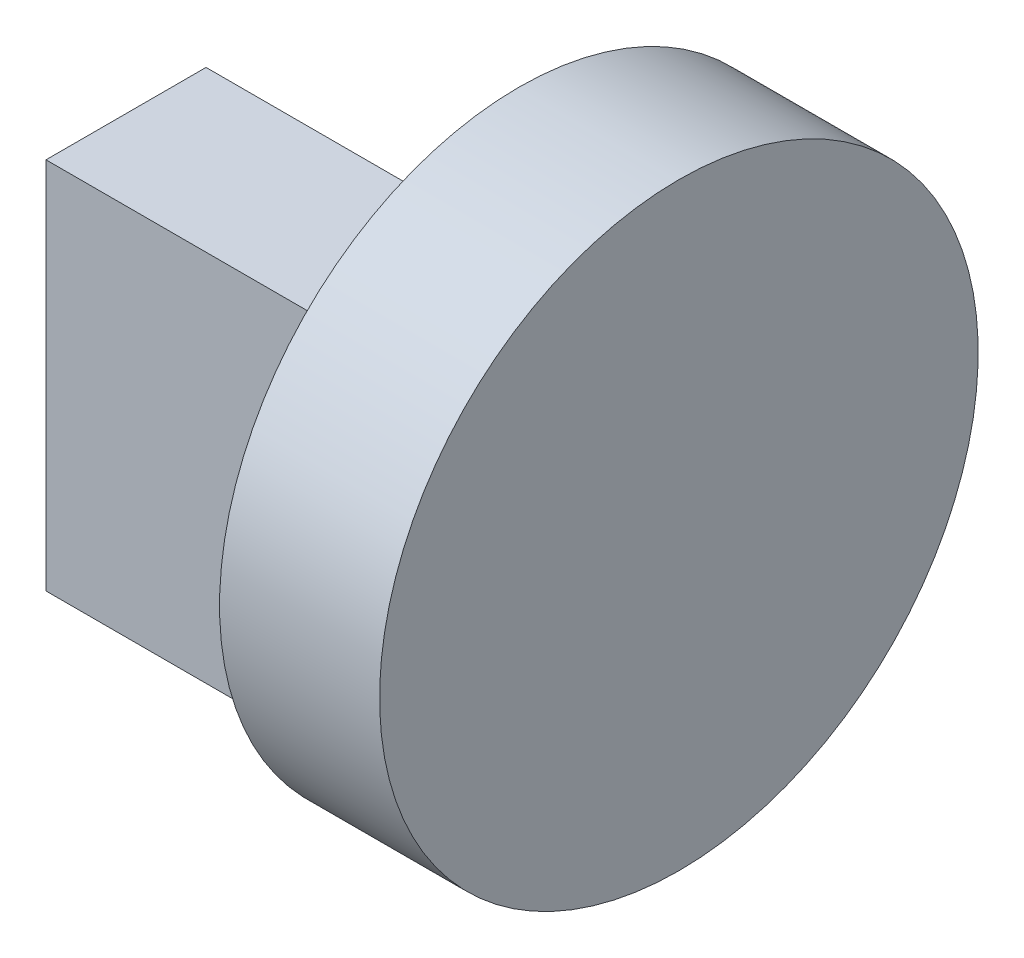
ISO-10303-21;
HEADER;
FILE_DESCRIPTION(('STEP AP214'),'2;1');
FILE_NAME('part.step','',(''),(''),'','','');
FILE_SCHEMA(('AUTOMOTIVE_DESIGN { 1 0 10303 214 1 1 1 1 }'));
ENDSEC;
DATA;
#1=APPLICATION_CONTEXT('core data for automotive mechanical design processes');
#2=APPLICATION_PROTOCOL_DEFINITION('international standard','automotive_design',2000,#1);
#3=PRODUCT_CONTEXT('',#1,'mechanical');
#4=PRODUCT('Part','Part','',(#3));
#5=PRODUCT_RELATED_PRODUCT_CATEGORY('part','',(#4));
#6=PRODUCT_DEFINITION_FORMATION('','',#4);
#7=PRODUCT_DEFINITION_CONTEXT('part definition',#1,'design');
#8=PRODUCT_DEFINITION('design','',#6,#7);
#9=PRODUCT_DEFINITION_SHAPE('','',#8);
#10=(LENGTH_UNIT() NAMED_UNIT(*) SI_UNIT(.MILLI.,.METRE.));
#11=(NAMED_UNIT(*) PLANE_ANGLE_UNIT() SI_UNIT($,.RADIAN.));
#12=(NAMED_UNIT(*) SI_UNIT($,.STERADIAN.) SOLID_ANGLE_UNIT());
#13=UNCERTAINTY_MEASURE_WITH_UNIT(LENGTH_MEASURE(1.E-05),#10,'distance_accuracy_value','');
#14=(GEOMETRIC_REPRESENTATION_CONTEXT(3) GLOBAL_UNCERTAINTY_ASSIGNED_CONTEXT((#13)) GLOBAL_UNIT_ASSIGNED_CONTEXT((#10,
#11,#12)) REPRESENTATION_CONTEXT('',''));
#15=CARTESIAN_POINT('',(0.,0.,0.));
#16=DIRECTION('',(0.,0.,1.));
#17=DIRECTION('',(1.,0.,0.));
#18=AXIS2_PLACEMENT_3D('',#15,#16,#17);
#19=CARTESIAN_POINT('',(25.,0.,15.));
#20=DIRECTION('',(1.,0.,0.));
#21=DIRECTION('',(0.,1.,0.));
#22=AXIS2_PLACEMENT_3D('',#19,#20,#21);
#23=PLANE('',#22);
#24=DIRECTION('',(0.,-1.,0.));
#25=VECTOR('',#24,1.);
#26=CARTESIAN_POINT('',(25.,0.,0.));
#27=LINE('',#26,#25);
#28=CARTESIAN_POINT('',(25.,0.,0.));
#29=VERTEX_POINT('',#28);
#30=CARTESIAN_POINT('',(25.,-35.,0.));
#31=VERTEX_POINT('',#30);
#32=EDGE_CURVE('E127',#29,#31,#27,.T.);
#33=ORIENTED_EDGE('',*,*,#32,.F.);
#34=DIRECTION('',(0.,0.,-1.));
#35=VECTOR('',#34,1.);
#36=CARTESIAN_POINT('',(25.,0.,15.));
#37=LINE('',#36,#35);
#38=CARTESIAN_POINT('',(25.,0.,15.));
#39=VERTEX_POINT('',#38);
#40=EDGE_CURVE('E143',#39,#29,#37,.T.);
#41=ORIENTED_EDGE('',*,*,#40,.F.);
#42=DIRECTION('',(0.,-1.,0.));
#43=VECTOR('',#42,1.);
#44=CARTESIAN_POINT('',(25.,0.,15.));
#45=LINE('',#44,#43);
#46=CARTESIAN_POINT('',(25.,-35.,15.));
#47=VERTEX_POINT('',#46);
#48=EDGE_CURVE('E136',#39,#47,#45,.T.);
#49=ORIENTED_EDGE('',*,*,#48,.T.);
#50=DIRECTION('',(0.,0.,-1.));
#51=VECTOR('',#50,1.);
#52=CARTESIAN_POINT('',(25.,-35.,15.));
#53=LINE('',#52,#51);
#54=EDGE_CURVE('E155',#47,#31,#53,.T.);
#55=ORIENTED_EDGE('',*,*,#54,.T.);
#56=EDGE_LOOP('',(#33,#41,#49,#55));
#57=FACE_BOUND('',#56,.T.);
#58=DIRECTION('',(0.,0.,-1.));
#59=VECTOR('',#58,1.);
#60=CARTESIAN_POINT('',(25.,-13.,0.));
#61=LINE('',#60,#59);
#62=CARTESIAN_POINT('',(25.,-13.,14.));
#63=VERTEX_POINT('',#62);
#64=CARTESIAN_POINT('',(25.,-13.,1.));
#65=VERTEX_POINT('',#64);
#66=EDGE_CURVE('E52',#63,#65,#61,.T.);
#67=ORIENTED_EDGE('',*,*,#66,.F.);
#68=DIRECTION('',(0.,-1.,0.));
#69=VECTOR('',#68,1.);
#70=CARTESIAN_POINT('',(25.,0.,14.));
#71=LINE('',#70,#69);
#72=CARTESIAN_POINT('',(25.,-0.999999999999998,14.));
#73=VERTEX_POINT('',#72);
#74=EDGE_CURVE('E123',#73,#63,#71,.T.);
#75=ORIENTED_EDGE('',*,*,#74,.F.);
#76=DIRECTION('',(0.,0.,-1.));
#77=VECTOR('',#76,1.);
#78=CARTESIAN_POINT('',(25.,-0.999999999999998,0.));
#79=LINE('',#78,#77);
#80=CARTESIAN_POINT('',(25.,-0.999999999999998,0.999999999999999));
#81=VERTEX_POINT('',#80);
#82=EDGE_CURVE('E120',#73,#81,#79,.T.);
#83=ORIENTED_EDGE('',*,*,#82,.T.);
#84=DIRECTION('',(0.,-1.,0.));
#85=VECTOR('',#84,1.);
#86=CARTESIAN_POINT('',(25.,0.,1.));
#87=LINE('',#86,#85);
#88=EDGE_CURVE('E57',#81,#65,#87,.T.);
#89=ORIENTED_EDGE('',*,*,#88,.T.);
#90=EDGE_LOOP('',(#67,#75,#83,#89));
#91=FACE_BOUND('',#90,.T.);
#92=ADVANCED_FACE('F37',(#57,#91),#23,.T.);
#93=CARTESIAN_POINT('',(0.,0.,15.));
#94=DIRECTION('',(0.,1.,0.));
#95=DIRECTION('',(0.,0.,1.));
#96=AXIS2_PLACEMENT_3D('',#93,#94,#95);
#97=PLANE('',#96);
#98=DIRECTION('',(1.,0.,0.));
#99=VECTOR('',#98,1.);
#100=CARTESIAN_POINT('',(0.,0.,0.));
#101=LINE('',#100,#99);
#102=CARTESIAN_POINT('',(0.,0.,0.));
#103=VERTEX_POINT('',#102);
#104=EDGE_CURVE('E124',#103,#29,#101,.T.);
#105=ORIENTED_EDGE('',*,*,#104,.F.);
#106=DIRECTION('',(0.,0.,-1.));
#107=VECTOR('',#106,1.);
#108=CARTESIAN_POINT('',(0.,0.,15.));
#109=LINE('',#108,#107);
#110=CARTESIAN_POINT('',(0.,0.,15.));
#111=VERTEX_POINT('',#110);
#112=EDGE_CURVE('E45',#111,#103,#109,.T.);
#113=ORIENTED_EDGE('',*,*,#112,.F.);
#114=DIRECTION('',(1.,0.,0.));
#115=VECTOR('',#114,1.);
#116=CARTESIAN_POINT('',(0.,0.,15.));
#117=LINE('',#116,#115);
#118=EDGE_CURVE('E133',#111,#39,#117,.T.);
#119=ORIENTED_EDGE('',*,*,#118,.T.);
#120=ORIENTED_EDGE('',*,*,#40,.T.);
#121=EDGE_LOOP('',(#105,#113,#119,#120));
#122=FACE_BOUND('',#121,.T.);
#123=ADVANCED_FACE('F39',(#122),#97,.T.);
#124=CARTESIAN_POINT('',(0.,0.,15.));
#125=DIRECTION('',(1.,0.,0.));
#126=DIRECTION('',(0.,0.,-1.));
#127=AXIS2_PLACEMENT_3D('',#124,#125,#126);
#128=PLANE('',#127);
#129=DIRECTION('',(0.,-1.,0.));
#130=VECTOR('',#129,1.);
#131=CARTESIAN_POINT('',(0.,0.,0.));
#132=LINE('',#131,#130);
#133=CARTESIAN_POINT('',(0.,-35.,0.));
#134=VERTEX_POINT('',#133);
#135=EDGE_CURVE('E137',#103,#134,#132,.T.);
#136=ORIENTED_EDGE('',*,*,#135,.T.);
#137=DIRECTION('',(0.,0.,-1.));
#138=VECTOR('',#137,1.);
#139=CARTESIAN_POINT('',(0.,-35.,15.));
#140=LINE('',#139,#138);
#141=CARTESIAN_POINT('',(0.,-35.,15.));
#142=VERTEX_POINT('',#141);
#143=EDGE_CURVE('E152',#142,#134,#140,.T.);
#144=ORIENTED_EDGE('',*,*,#143,.F.);
#145=DIRECTION('',(0.,-1.,0.));
#146=VECTOR('',#145,1.);
#147=CARTESIAN_POINT('',(0.,0.,15.));
#148=LINE('',#147,#146);
#149=EDGE_CURVE('E142',#111,#142,#148,.T.);
#150=ORIENTED_EDGE('',*,*,#149,.F.);
#151=ORIENTED_EDGE('',*,*,#112,.T.);
#152=EDGE_LOOP('',(#136,#144,#150,#151));
#153=FACE_BOUND('',#152,.T.);
#154=ADVANCED_FACE('F198',(#153),#128,.F.);
#155=CARTESIAN_POINT('',(0.,-35.,15.));
#156=DIRECTION('',(0.,1.,0.));
#157=DIRECTION('',(0.,0.,1.));
#158=AXIS2_PLACEMENT_3D('',#155,#156,#157);
#159=PLANE('',#158);
#160=DIRECTION('',(1.,0.,0.));
#161=VECTOR('',#160,1.);
#162=CARTESIAN_POINT('',(0.,-35.,0.));
#163=LINE('',#162,#161);
#164=EDGE_CURVE('E147',#134,#31,#163,.T.);
#165=ORIENTED_EDGE('',*,*,#164,.T.);
#166=ORIENTED_EDGE('',*,*,#54,.F.);
#167=DIRECTION('',(1.,0.,0.));
#168=VECTOR('',#167,1.);
#169=CARTESIAN_POINT('',(0.,-35.,15.));
#170=LINE('',#169,#168);
#171=EDGE_CURVE('E140',#142,#47,#170,.T.);
#172=ORIENTED_EDGE('',*,*,#171,.F.);
#173=ORIENTED_EDGE('',*,*,#143,.T.);
#174=EDGE_LOOP('',(#165,#166,#172,#173));
#175=FACE_BOUND('',#174,.T.);
#176=ADVANCED_FACE('F202',(#175),#159,.F.);
#177=CARTESIAN_POINT('',(0.,0.,15.));
#178=DIRECTION('',(0.,0.,-1.));
#179=DIRECTION('',(-1.,0.,0.));
#180=AXIS2_PLACEMENT_3D('',#177,#178,#179);
#181=PLANE('',#180);
#182=ORIENTED_EDGE('',*,*,#118,.F.);
#183=ORIENTED_EDGE('',*,*,#149,.T.);
#184=ORIENTED_EDGE('',*,*,#171,.T.);
#185=ORIENTED_EDGE('',*,*,#48,.F.);
#186=EDGE_LOOP('',(#182,#183,#184,#185));
#187=FACE_BOUND('',#186,.T.);
#188=ADVANCED_FACE('F205',(#187),#181,.F.);
#189=CARTESIAN_POINT('',(0.,0.,0.));
#190=DIRECTION('',(0.,0.,-1.));
#191=DIRECTION('',(-1.,0.,0.));
#192=AXIS2_PLACEMENT_3D('',#189,#190,#191);
#193=PLANE('',#192);
#194=ORIENTED_EDGE('',*,*,#104,.T.);
#195=ORIENTED_EDGE('',*,*,#32,.T.);
#196=ORIENTED_EDGE('',*,*,#164,.F.);
#197=ORIENTED_EDGE('',*,*,#135,.F.);
#198=EDGE_LOOP('',(#194,#195,#196,#197));
#199=FACE_BOUND('',#198,.T.);
#200=ADVANCED_FACE('F210',(#199),#193,.T.);
#201=CARTESIAN_POINT('',(30.,0.,14.));
#202=DIRECTION('',(0.,0.,-1.));
#203=DIRECTION('',(-1.,0.,0.));
#204=AXIS2_PLACEMENT_3D('',#201,#202,#203);
#205=PLANE('',#204);
#206=ORIENTED_EDGE('',*,*,#74,.T.);
#207=DIRECTION('',(-1.,0.,0.));
#208=VECTOR('',#207,1.);
#209=CARTESIAN_POINT('',(30.,-13.,14.));
#210=LINE('',#209,#208);
#211=CARTESIAN_POINT('',(30.,-13.,14.));
#212=VERTEX_POINT('',#211);
#213=EDGE_CURVE('E104',#212,#63,#210,.T.);
#214=ORIENTED_EDGE('',*,*,#213,.F.);
#215=DIRECTION('',(0.,-1.,0.));
#216=VECTOR('',#215,1.);
#217=CARTESIAN_POINT('',(30.,0.,14.));
#218=LINE('',#217,#216);
#219=CARTESIAN_POINT('',(30.,-0.999999999999997,14.));
#220=VERTEX_POINT('',#219);
#221=EDGE_CURVE('E111',#220,#212,#218,.T.);
#222=ORIENTED_EDGE('',*,*,#221,.F.);
#223=DIRECTION('',(-1.,0.,0.));
#224=VECTOR('',#223,1.);
#225=CARTESIAN_POINT('',(30.,-0.999999999999997,14.));
#226=LINE('',#225,#224);
#227=EDGE_CURVE('E174',#220,#73,#226,.T.);
#228=ORIENTED_EDGE('',*,*,#227,.T.);
#229=EDGE_LOOP('',(#206,#214,#222,#228));
#230=FACE_BOUND('',#229,.T.);
#231=ADVANCED_FACE('F122',(#230),#205,.F.);
#232=CARTESIAN_POINT('',(30.,-13.,0.));
#233=DIRECTION('',(0.,1.,0.));
#234=DIRECTION('',(-1.,0.,0.));
#235=AXIS2_PLACEMENT_3D('',#232,#233,#234);
#236=PLANE('',#235);
#237=ORIENTED_EDGE('',*,*,#66,.T.);
#238=DIRECTION('',(-1.,0.,0.));
#239=VECTOR('',#238,1.);
#240=CARTESIAN_POINT('',(30.,-13.,1.));
#241=LINE('',#240,#239);
#242=CARTESIAN_POINT('',(30.,-13.,1.));
#243=VERTEX_POINT('',#242);
#244=EDGE_CURVE('E106',#243,#65,#241,.T.);
#245=ORIENTED_EDGE('',*,*,#244,.F.);
#246=DIRECTION('',(0.,0.,-1.));
#247=VECTOR('',#246,1.);
#248=CARTESIAN_POINT('',(30.,-13.,0.));
#249=LINE('',#248,#247);
#250=EDGE_CURVE('E100',#212,#243,#249,.T.);
#251=ORIENTED_EDGE('',*,*,#250,.F.);
#252=ORIENTED_EDGE('',*,*,#213,.T.);
#253=EDGE_LOOP('',(#237,#245,#251,#252));
#254=FACE_BOUND('',#253,.T.);
#255=ADVANCED_FACE('F102',(#254),#236,.F.);
#256=CARTESIAN_POINT('',(30.,0.,1.));
#257=DIRECTION('',(0.,0.,-1.));
#258=DIRECTION('',(0.,1.,0.));
#259=AXIS2_PLACEMENT_3D('',#256,#257,#258);
#260=PLANE('',#259);
#261=ORIENTED_EDGE('',*,*,#88,.F.);
#262=DIRECTION('',(-1.,0.,0.));
#263=VECTOR('',#262,1.);
#264=CARTESIAN_POINT('',(30.,-0.999999999999997,1.));
#265=LINE('',#264,#263);
#266=CARTESIAN_POINT('',(30.,-0.999999999999997,1.));
#267=VERTEX_POINT('',#266);
#268=EDGE_CURVE('E129',#267,#81,#265,.T.);
#269=ORIENTED_EDGE('',*,*,#268,.F.);
#270=DIRECTION('',(0.,-1.,0.));
#271=VECTOR('',#270,1.);
#272=CARTESIAN_POINT('',(30.,0.,1.));
#273=LINE('',#272,#271);
#274=EDGE_CURVE('E110',#267,#243,#273,.T.);
#275=ORIENTED_EDGE('',*,*,#274,.T.);
#276=ORIENTED_EDGE('',*,*,#244,.T.);
#277=EDGE_LOOP('',(#261,#269,#275,#276));
#278=FACE_BOUND('',#277,.T.);
#279=ADVANCED_FACE('F184',(#278),#260,.T.);
#280=CARTESIAN_POINT('',(30.,-0.999999999999997,0.));
#281=DIRECTION('',(0.,1.,0.));
#282=DIRECTION('',(-1.,0.,0.));
#283=AXIS2_PLACEMENT_3D('',#280,#281,#282);
#284=PLANE('',#283);
#285=ORIENTED_EDGE('',*,*,#82,.F.);
#286=ORIENTED_EDGE('',*,*,#227,.F.);
#287=DIRECTION('',(0.,0.,-1.));
#288=VECTOR('',#287,1.);
#289=CARTESIAN_POINT('',(30.,-0.999999999999997,0.));
#290=LINE('',#289,#288);
#291=EDGE_CURVE('E117',#220,#267,#290,.T.);
#292=ORIENTED_EDGE('',*,*,#291,.T.);
#293=ORIENTED_EDGE('',*,*,#268,.T.);
#294=EDGE_LOOP('',(#285,#286,#292,#293));
#295=FACE_BOUND('',#294,.T.);
#296=ADVANCED_FACE('F182',(#295),#284,.T.);
#297=CARTESIAN_POINT('',(30.,0.,0.));
#298=DIRECTION('',(1.,0.,0.));
#299=DIRECTION('',(0.,1.,0.));
#300=AXIS2_PLACEMENT_3D('',#297,#298,#299);
#301=PLANE('',#300);
#302=CARTESIAN_POINT('',(30.,-7.49999999999999,7.5));
#303=DIRECTION('',(1.,0.,0.));
#304=DIRECTION('',(0.,1.,0.));
#305=AXIS2_PLACEMENT_3D('',#302,#303,#304);
#306=CIRCLE('',#305,4.);
#307=CARTESIAN_POINT('',(30.,-3.49999999999999,7.5));
#308=VERTEX_POINT('',#307);
#309=EDGE_CURVE('E157',#308,#308,#306,.F.);
#310=ORIENTED_EDGE('',*,*,#309,.T.);
#311=EDGE_LOOP('',(#310));
#312=FACE_BOUND('',#311,.T.);
#313=ORIENTED_EDGE('',*,*,#221,.T.);
#314=ORIENTED_EDGE('',*,*,#250,.T.);
#315=ORIENTED_EDGE('',*,*,#274,.F.);
#316=ORIENTED_EDGE('',*,*,#291,.F.);
#317=EDGE_LOOP('',(#313,#314,#315,#316));
#318=FACE_BOUND('',#317,.T.);
#319=ADVANCED_FACE('F115',(#312,#318),#301,.T.);
#320=CARTESIAN_POINT('',(32.,-7.49999999999999,7.5));
#321=DIRECTION('',(-1.,0.,0.));
#322=DIRECTION('',(0.,0.,1.));
#323=AXIS2_PLACEMENT_3D('',#320,#321,#322);
#324=CYLINDRICAL_SURFACE('',#323,4.);
#325=ORIENTED_EDGE('',*,*,#309,.F.);
#326=EDGE_LOOP('',(#325));
#327=FACE_BOUND('',#326,.T.);
#328=CARTESIAN_POINT('',(32.,-7.49999999999999,7.5));
#329=DIRECTION('',(1.,0.,0.));
#330=DIRECTION('',(0.,1.,0.));
#331=AXIS2_PLACEMENT_3D('',#328,#329,#330);
#332=CIRCLE('',#331,4.);
#333=CARTESIAN_POINT('',(32.,-3.49999999999999,7.5));
#334=VERTEX_POINT('',#333);
#335=EDGE_CURVE('E159',#334,#334,#332,.T.);
#336=ORIENTED_EDGE('',*,*,#335,.F.);
#337=EDGE_LOOP('',(#336));
#338=FACE_BOUND('',#337,.T.);
#339=ADVANCED_FACE('F253',(#327,#338),#324,.T.);
#340=CARTESIAN_POINT('',(32.,-7.49999999999999,7.5));
#341=DIRECTION('',(1.,0.,0.));
#342=DIRECTION('',(0.,1.,0.));
#343=AXIS2_PLACEMENT_3D('',#340,#341,#342);
#344=PLANE('',#343);
#345=CARTESIAN_POINT('',(32.,-7.5,7.5));
#346=DIRECTION('',(1.,0.,0.));
#347=DIRECTION('',(0.,1.,0.));
#348=AXIS2_PLACEMENT_3D('',#345,#346,#347);
#349=CIRCLE('',#348,1.5);
#350=CARTESIAN_POINT('',(32.,-6.,7.5));
#351=VERTEX_POINT('',#350);
#352=EDGE_CURVE('E11',#351,#351,#349,.T.);
#353=ORIENTED_EDGE('',*,*,#352,.F.);
#354=EDGE_LOOP('',(#353));
#355=FACE_BOUND('',#354,.T.);
#356=ORIENTED_EDGE('',*,*,#335,.T.);
#357=EDGE_LOOP('',(#356));
#358=FACE_BOUND('',#357,.T.);
#359=ADVANCED_FACE('F262',(#355,#358),#344,.T.);
#360=CARTESIAN_POINT('',(30.,-7.5,7.5));
#361=DIRECTION('',(1.,0.,0.));
#362=DIRECTION('',(0.,0.,-1.));
#363=AXIS2_PLACEMENT_3D('',#360,#361,#362);
#364=CYLINDRICAL_SURFACE('',#363,1.5);
#365=ORIENTED_EDGE('',*,*,#352,.T.);
#366=EDGE_LOOP('',(#365));
#367=FACE_BOUND('',#366,.T.);
#368=CARTESIAN_POINT('',(36.8195828414154,-7.5,7.5));
#369=DIRECTION('',(1.,0.,0.));
#370=DIRECTION('',(0.,1.,0.));
#371=AXIS2_PLACEMENT_3D('',#368,#369,#370);
#372=CIRCLE('',#371,1.5);
#373=CARTESIAN_POINT('',(36.8195828414154,-6.,7.5));
#374=VERTEX_POINT('',#373);
#375=EDGE_CURVE('E164',#374,#374,#372,.T.);
#376=ORIENTED_EDGE('',*,*,#375,.F.);
#377=EDGE_LOOP('',(#376));
#378=FACE_BOUND('',#377,.T.);
#379=ADVANCED_FACE('F272',(#367,#378),#364,.T.);
#380=CARTESIAN_POINT('',(51.8195828414154,-7.49999999999999,7.5));
#381=DIRECTION('',(-1.,0.,0.));
#382=DIRECTION('',(0.,0.,1.));
#383=AXIS2_PLACEMENT_3D('',#380,#381,#382);
#384=CYLINDRICAL_SURFACE('',#383,28.0533397053908);
#385=CARTESIAN_POINT('',(51.8195828414154,-7.49999999999999,7.5));
#386=DIRECTION('',(1.,0.,0.));
#387=DIRECTION('',(0.,1.,0.));
#388=AXIS2_PLACEMENT_3D('',#385,#386,#387);
#389=CIRCLE('',#388,28.0533397053908);
#390=CARTESIAN_POINT('',(51.8195828414154,20.5533397053908,7.5));
#391=VERTEX_POINT('',#390);
#392=EDGE_CURVE('E169',#391,#391,#389,.T.);
#393=ORIENTED_EDGE('',*,*,#392,.F.);
#394=EDGE_LOOP('',(#393));
#395=FACE_BOUND('',#394,.T.);
#396=CARTESIAN_POINT('',(36.8195828414154,-7.49999999999999,7.5));
#397=DIRECTION('',(1.,0.,0.));
#398=DIRECTION('',(0.,1.,0.));
#399=AXIS2_PLACEMENT_3D('',#396,#397,#398);
#400=CIRCLE('',#399,28.0533397053908);
#401=CARTESIAN_POINT('',(36.8195828414154,20.5533397053908,7.5));
#402=VERTEX_POINT('',#401);
#403=EDGE_CURVE('E320',#402,#402,#400,.T.);
#404=ORIENTED_EDGE('',*,*,#403,.T.);
#405=EDGE_LOOP('',(#404));
#406=FACE_BOUND('',#405,.T.);
#407=ADVANCED_FACE('F282',(#395,#406),#384,.T.);
#408=CARTESIAN_POINT('',(51.8195828414154,-7.49999999999999,7.5));
#409=DIRECTION('',(1.,0.,0.));
#410=DIRECTION('',(0.,1.,0.));
#411=AXIS2_PLACEMENT_3D('',#408,#409,#410);
#412=PLANE('',#411);
#413=ORIENTED_EDGE('',*,*,#392,.T.);
#414=EDGE_LOOP('',(#413));
#415=FACE_BOUND('',#414,.T.);
#416=ADVANCED_FACE('F292',(#415),#412,.T.);
#417=CARTESIAN_POINT('',(36.8195828414154,-7.49999999999999,7.5));
#418=DIRECTION('',(1.,0.,0.));
#419=DIRECTION('',(0.,1.,0.));
#420=AXIS2_PLACEMENT_3D('',#417,#418,#419);
#421=PLANE('',#420);
#422=ORIENTED_EDGE('',*,*,#375,.T.);
#423=EDGE_LOOP('',(#422));
#424=FACE_BOUND('',#423,.T.);
#425=ORIENTED_EDGE('',*,*,#403,.F.);
#426=EDGE_LOOP('',(#425));
#427=FACE_BOUND('',#426,.T.);
#428=ADVANCED_FACE('F302',(#424,#427),#421,.F.);
#429=CLOSED_SHELL('',(#92,#123,#154,#176,#188,#200,#231,#255,#279,#296,#319,#339,#359,#379,#407,
#416,#428));
#430=MANIFOLD_SOLID_BREP('B2',#429);
#431=ADVANCED_BREP_SHAPE_REPRESENTATION('',(#18,#430),#14);
#432=SHAPE_DEFINITION_REPRESENTATION(#9,#431);
ENDSEC;
END-ISO-10303-21;
